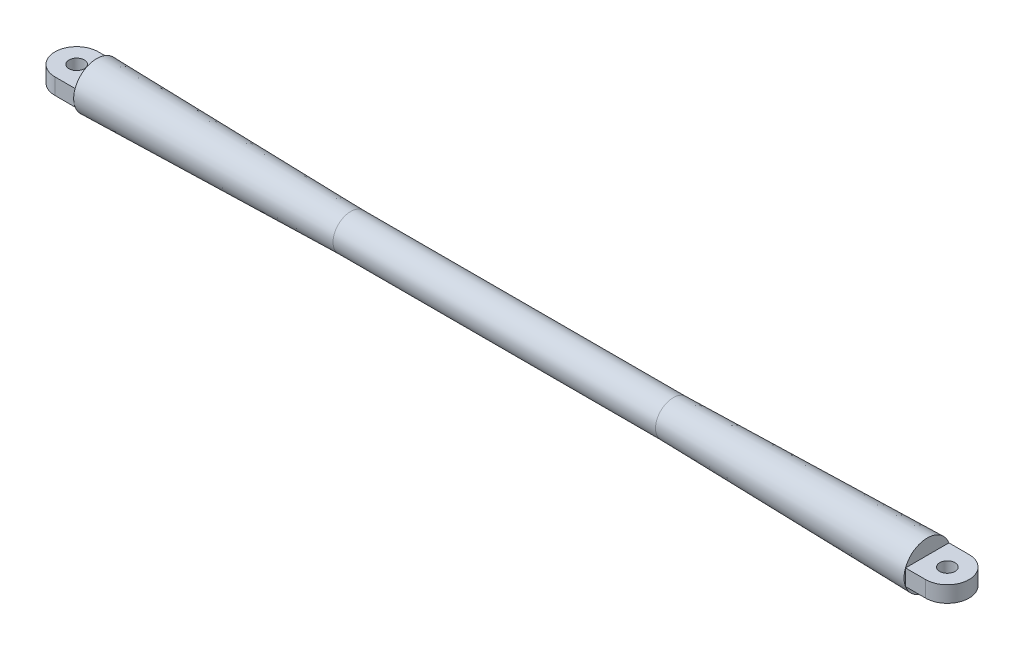
ISO-10303-21;
HEADER;
FILE_DESCRIPTION(('STEP AP214'),'2;1');
FILE_NAME('part.step','',(''),(''),'','','');
FILE_SCHEMA(('AUTOMOTIVE_DESIGN { 1 0 10303 214 1 1 1 1 }'));
ENDSEC;
DATA;
#1=APPLICATION_CONTEXT('core data for automotive mechanical design processes');
#2=APPLICATION_PROTOCOL_DEFINITION('international standard','automotive_design',2000,#1);
#3=PRODUCT_CONTEXT('',#1,'mechanical');
#4=PRODUCT('Part','Part','',(#3));
#5=PRODUCT_RELATED_PRODUCT_CATEGORY('part','',(#4));
#6=PRODUCT_DEFINITION_FORMATION('','',#4);
#7=PRODUCT_DEFINITION_CONTEXT('part definition',#1,'design');
#8=PRODUCT_DEFINITION('design','',#6,#7);
#9=PRODUCT_DEFINITION_SHAPE('','',#8);
#10=(LENGTH_UNIT() NAMED_UNIT(*) SI_UNIT(.MILLI.,.METRE.));
#11=(NAMED_UNIT(*) PLANE_ANGLE_UNIT() SI_UNIT($,.RADIAN.));
#12=(NAMED_UNIT(*) SI_UNIT($,.STERADIAN.) SOLID_ANGLE_UNIT());
#13=UNCERTAINTY_MEASURE_WITH_UNIT(LENGTH_MEASURE(1.E-05),#10,'distance_accuracy_value','');
#14=(GEOMETRIC_REPRESENTATION_CONTEXT(3) GLOBAL_UNCERTAINTY_ASSIGNED_CONTEXT((#13)) GLOBAL_UNIT_ASSIGNED_CONTEXT((#10,
#11,#12)) REPRESENTATION_CONTEXT('',''));
#15=CARTESIAN_POINT('',(0.,0.,0.));
#16=DIRECTION('',(0.,0.,1.));
#17=DIRECTION('',(1.,0.,0.));
#18=AXIS2_PLACEMENT_3D('',#15,#16,#17);
#19=CARTESIAN_POINT('',(575.,0.,0.));
#20=DIRECTION('',(1.,0.,0.));
#21=DIRECTION('',(0.,0.,-1.));
#22=AXIS2_PLACEMENT_3D('',#19,#20,#21);
#23=CONICAL_SURFACE('',#22,30.,0.0213300978711052);
#24=CARTESIAN_POINT('',(200.,0.,0.));
#25=DIRECTION('',(-1.,0.,0.));
#26=DIRECTION('',(0.,0.,1.));
#27=AXIS2_PLACEMENT_3D('',#24,#25,#26);
#28=CIRCLE('',#27,22.);
#29=CARTESIAN_POINT('',(200.,0.,22.));
#30=VERTEX_POINT('',#29);
#31=EDGE_CURVE('E216',#30,#30,#28,.T.);
#32=ORIENTED_EDGE('',*,*,#31,.F.);
#33=EDGE_LOOP('',(#32));
#34=FACE_BOUND('',#33,.T.);
#35=CARTESIAN_POINT('',(515.,0.,0.));
#36=DIRECTION('',(-1.,0.,0.));
#37=DIRECTION('',(0.,0.,1.));
#38=AXIS2_PLACEMENT_3D('',#35,#36,#37);
#39=CIRCLE('',#38,28.72);
#40=CARTESIAN_POINT('',(515.,10.,26.9228230317699));
#41=VERTEX_POINT('',#40);
#42=CARTESIAN_POINT('',(515.,10.,-26.9228230317699));
#43=VERTEX_POINT('',#42);
#44=EDGE_CURVE('E227',#41,#43,#39,.T.);
#45=ORIENTED_EDGE('',*,*,#44,.T.);
#46=CARTESIAN_POINT('',(515.,0.,0.));
#47=DIRECTION('',(-1.,0.,0.));
#48=DIRECTION('',(0.,-1.,0.));
#49=AXIS2_PLACEMENT_3D('',#46,#47,#48);
#50=CIRCLE('',#49,28.72);
#51=CARTESIAN_POINT('',(515.,-10.,-26.9228230317699));
#52=VERTEX_POINT('',#51);
#53=EDGE_CURVE('E207',#43,#52,#50,.T.);
#54=ORIENTED_EDGE('',*,*,#53,.T.);
#55=CARTESIAN_POINT('',(515.,0.,0.));
#56=DIRECTION('',(-1.,0.,0.));
#57=DIRECTION('',(0.,0.,1.));
#58=AXIS2_PLACEMENT_3D('',#55,#56,#57);
#59=CIRCLE('',#58,28.72);
#60=CARTESIAN_POINT('',(515.,-10.,26.9228230317699));
#61=VERTEX_POINT('',#60);
#62=EDGE_CURVE('E223',#52,#61,#59,.T.);
#63=ORIENTED_EDGE('',*,*,#62,.T.);
#64=CARTESIAN_POINT('',(515.,0.,0.));
#65=DIRECTION('',(-1.,0.,0.));
#66=DIRECTION('',(0.,-1.,0.));
#67=AXIS2_PLACEMENT_3D('',#64,#65,#66);
#68=CIRCLE('',#67,28.72);
#69=EDGE_CURVE('E203',#61,#41,#68,.T.);
#70=ORIENTED_EDGE('',*,*,#69,.T.);
#71=EDGE_LOOP('',(#45,#54,#63,#70));
#72=FACE_BOUND('',#71,.T.);
#73=ADVANCED_FACE('F41',(#34,#72),#23,.T.);
#74=CARTESIAN_POINT('',(0.,0.,0.));
#75=DIRECTION('',(-1.,0.,0.));
#76=DIRECTION('',(0.,0.,1.));
#77=AXIS2_PLACEMENT_3D('',#74,#75,#76);
#78=CYLINDRICAL_SURFACE('',#77,22.);
#79=ORIENTED_EDGE('',*,*,#31,.T.);
#80=EDGE_LOOP('',(#79));
#81=FACE_BOUND('',#80,.T.);
#82=CARTESIAN_POINT('',(-200.,0.,0.));
#83=DIRECTION('',(-1.,0.,0.));
#84=DIRECTION('',(0.,0.,1.));
#85=AXIS2_PLACEMENT_3D('',#82,#83,#84);
#86=CIRCLE('',#85,22.);
#87=CARTESIAN_POINT('',(-200.,0.,22.));
#88=VERTEX_POINT('',#87);
#89=EDGE_CURVE('E153',#88,#88,#86,.T.);
#90=ORIENTED_EDGE('',*,*,#89,.F.);
#91=EDGE_LOOP('',(#90));
#92=FACE_BOUND('',#91,.T.);
#93=ADVANCED_FACE('F268',(#81,#92),#78,.T.);
#94=CARTESIAN_POINT('',(515.,-50.2037310224128,-35.));
#95=DIRECTION('',(-1.,0.,0.));
#96=DIRECTION('',(0.,0.,1.));
#97=AXIS2_PLACEMENT_3D('',#94,#95,#96);
#98=PLANE('',#97);
#99=DIRECTION('',(0.,0.,1.));
#100=VECTOR('',#99,1.);
#101=CARTESIAN_POINT('',(515.,-10.,-35.));
#102=LINE('',#101,#100);
#103=EDGE_CURVE('E211',#52,#61,#102,.T.);
#104=ORIENTED_EDGE('',*,*,#103,.T.);
#105=ORIENTED_EDGE('',*,*,#62,.F.);
#106=EDGE_LOOP('',(#104,#105));
#107=FACE_BOUND('',#106,.T.);
#108=ADVANCED_FACE('F249',(#107),#98,.F.);
#109=CARTESIAN_POINT('',(515.,-10.,-35.));
#110=DIRECTION('',(0.,1.,0.));
#111=DIRECTION('',(-1.,0.,0.));
#112=AXIS2_PLACEMENT_3D('',#109,#110,#111);
#113=PLANE('',#112);
#114=CARTESIAN_POINT('',(540.,-10.,0.));
#115=DIRECTION('',(0.,1.,0.));
#116=DIRECTION('',(-1.,0.,0.));
#117=AXIS2_PLACEMENT_3D('',#114,#115,#116);
#118=CIRCLE('',#117,9.49999999999995);
#119=CARTESIAN_POINT('',(530.5,-10.,0.));
#120=VERTEX_POINT('',#119);
#121=EDGE_CURVE('E175',#120,#120,#118,.T.);
#122=ORIENTED_EDGE('',*,*,#121,.T.);
#123=EDGE_LOOP('',(#122));
#124=FACE_BOUND('',#123,.T.);
#125=CARTESIAN_POINT('',(540.,-10.,0.));
#126=DIRECTION('',(0.,1.,0.));
#127=DIRECTION('',(-1.,0.,0.));
#128=AXIS2_PLACEMENT_3D('',#125,#126,#127);
#129=CIRCLE('',#128,26.9228230317699);
#130=CARTESIAN_POINT('',(540.,-10.,-26.9228230317699));
#131=VERTEX_POINT('',#130);
#132=CARTESIAN_POINT('',(540.,-10.,26.9228230317699));
#133=VERTEX_POINT('',#132);
#134=EDGE_CURVE('E195',#131,#133,#129,.F.);
#135=ORIENTED_EDGE('',*,*,#134,.T.);
#136=DIRECTION('',(-1.,0.,0.));
#137=VECTOR('',#136,1.);
#138=CARTESIAN_POINT('',(515.,-10.,26.9228230317699));
#139=LINE('',#138,#137);
#140=EDGE_CURVE('E199',#133,#61,#139,.T.);
#141=ORIENTED_EDGE('',*,*,#140,.T.);
#142=ORIENTED_EDGE('',*,*,#103,.F.);
#143=DIRECTION('',(1.,0.,0.));
#144=VECTOR('',#143,1.);
#145=CARTESIAN_POINT('',(515.,-10.,-26.9228230317699));
#146=LINE('',#145,#144);
#147=EDGE_CURVE('E182',#52,#131,#146,.T.);
#148=ORIENTED_EDGE('',*,*,#147,.T.);
#149=EDGE_LOOP('',(#135,#141,#142,#148));
#150=FACE_BOUND('',#149,.T.);
#151=ADVANCED_FACE('F246',(#124,#150),#113,.F.);
#152=CARTESIAN_POINT('',(515.,50.2037310224128,-35.));
#153=DIRECTION('',(-1.,0.,0.));
#154=DIRECTION('',(0.,0.,1.));
#155=AXIS2_PLACEMENT_3D('',#152,#153,#154);
#156=PLANE('',#155);
#157=DIRECTION('',(0.,0.,1.));
#158=VECTOR('',#157,1.);
#159=CARTESIAN_POINT('',(515.,10.,-35.));
#160=LINE('',#159,#158);
#161=EDGE_CURVE('E212',#43,#41,#160,.T.);
#162=ORIENTED_EDGE('',*,*,#161,.F.);
#163=ORIENTED_EDGE('',*,*,#44,.F.);
#164=EDGE_LOOP('',(#162,#163));
#165=FACE_BOUND('',#164,.T.);
#166=ADVANCED_FACE('F263',(#165),#156,.F.);
#167=CARTESIAN_POINT('',(515.,10.,-35.));
#168=DIRECTION('',(0.,-1.,0.));
#169=DIRECTION('',(1.,0.,0.));
#170=AXIS2_PLACEMENT_3D('',#167,#168,#169);
#171=PLANE('',#170);
#172=CARTESIAN_POINT('',(540.,10.,0.));
#173=DIRECTION('',(0.,1.,0.));
#174=DIRECTION('',(-1.,0.,0.));
#175=AXIS2_PLACEMENT_3D('',#172,#173,#174);
#176=CIRCLE('',#175,9.49999999999995);
#177=CARTESIAN_POINT('',(530.5,10.,0.));
#178=VERTEX_POINT('',#177);
#179=EDGE_CURVE('E171',#178,#178,#176,.T.);
#180=ORIENTED_EDGE('',*,*,#179,.F.);
#181=EDGE_LOOP('',(#180));
#182=FACE_BOUND('',#181,.T.);
#183=ORIENTED_EDGE('',*,*,#161,.T.);
#184=DIRECTION('',(1.,0.,0.));
#185=VECTOR('',#184,1.);
#186=CARTESIAN_POINT('',(515.,10.,26.9228230317699));
#187=LINE('',#186,#185);
#188=CARTESIAN_POINT('',(540.,10.,26.9228230317699));
#189=VERTEX_POINT('',#188);
#190=EDGE_CURVE('E11',#41,#189,#187,.T.);
#191=ORIENTED_EDGE('',*,*,#190,.T.);
#192=CARTESIAN_POINT('',(540.,10.,0.));
#193=DIRECTION('',(0.,-1.,0.));
#194=DIRECTION('',(1.,0.,0.));
#195=AXIS2_PLACEMENT_3D('',#192,#193,#194);
#196=CIRCLE('',#195,26.9228230317699);
#197=CARTESIAN_POINT('',(540.,10.,-26.9228230317699));
#198=VERTEX_POINT('',#197);
#199=EDGE_CURVE('E49',#189,#198,#196,.F.);
#200=ORIENTED_EDGE('',*,*,#199,.T.);
#201=DIRECTION('',(-1.,0.,0.));
#202=VECTOR('',#201,1.);
#203=CARTESIAN_POINT('',(515.,10.,-26.9228230317699));
#204=LINE('',#203,#202);
#205=EDGE_CURVE('E231',#198,#43,#204,.T.);
#206=ORIENTED_EDGE('',*,*,#205,.T.);
#207=EDGE_LOOP('',(#183,#191,#200,#206));
#208=FACE_BOUND('',#207,.T.);
#209=ADVANCED_FACE('F237',(#182,#208),#171,.F.);
#210=CARTESIAN_POINT('',(515.,-25.,-26.9228230317699));
#211=DIRECTION('',(-1.,0.,0.));
#212=DIRECTION('',(0.,-1.,0.));
#213=AXIS2_PLACEMENT_3D('',#210,#211,#212);
#214=PLANE('',#213);
#215=DIRECTION('',(0.,1.,0.));
#216=VECTOR('',#215,1.);
#217=CARTESIAN_POINT('',(515.,-25.,-26.9228230317699));
#218=LINE('',#217,#216);
#219=EDGE_CURVE('E56',#52,#43,#218,.T.);
#220=ORIENTED_EDGE('',*,*,#219,.F.);
#221=ORIENTED_EDGE('',*,*,#53,.F.);
#222=EDGE_LOOP('',(#220,#221));
#223=FACE_BOUND('',#222,.T.);
#224=ADVANCED_FACE('F253',(#223),#214,.F.);
#225=CARTESIAN_POINT('',(515.,-25.,33.4261094628097));
#226=DIRECTION('',(-1.,0.,0.));
#227=DIRECTION('',(0.,-1.,0.));
#228=AXIS2_PLACEMENT_3D('',#225,#226,#227);
#229=PLANE('',#228);
#230=DIRECTION('',(0.,1.,0.));
#231=VECTOR('',#230,1.);
#232=CARTESIAN_POINT('',(515.,-25.,26.9228230317699));
#233=LINE('',#232,#231);
#234=EDGE_CURVE('E179',#61,#41,#233,.T.);
#235=ORIENTED_EDGE('',*,*,#234,.T.);
#236=ORIENTED_EDGE('',*,*,#69,.F.);
#237=EDGE_LOOP('',(#235,#236));
#238=FACE_BOUND('',#237,.T.);
#239=ADVANCED_FACE('F255',(#238),#229,.F.);
#240=CARTESIAN_POINT('',(540.,-25.,26.9228230317699));
#241=DIRECTION('',(0.,0.,-1.));
#242=DIRECTION('',(-1.,0.,0.));
#243=AXIS2_PLACEMENT_3D('',#240,#241,#242);
#244=PLANE('',#243);
#245=DIRECTION('',(0.,1.,0.));
#246=VECTOR('',#245,1.);
#247=CARTESIAN_POINT('',(540.,-25.,26.9228230317699));
#248=LINE('',#247,#246);
#249=EDGE_CURVE('E183',#133,#189,#248,.T.);
#250=ORIENTED_EDGE('',*,*,#249,.T.);
#251=ORIENTED_EDGE('',*,*,#190,.F.);
#252=ORIENTED_EDGE('',*,*,#234,.F.);
#253=ORIENTED_EDGE('',*,*,#140,.F.);
#254=EDGE_LOOP('',(#250,#251,#252,#253));
#255=FACE_BOUND('',#254,.T.);
#256=ADVANCED_FACE('F243',(#255),#244,.F.);
#257=CARTESIAN_POINT('',(540.,-25.,0.));
#258=DIRECTION('',(0.,1.,0.));
#259=DIRECTION('',(-1.,0.,0.));
#260=AXIS2_PLACEMENT_3D('',#257,#258,#259);
#261=CYLINDRICAL_SURFACE('',#260,26.9228230317699);
#262=DIRECTION('',(0.,1.,0.));
#263=VECTOR('',#262,1.);
#264=CARTESIAN_POINT('',(540.,-25.,-26.9228230317699));
#265=LINE('',#264,#263);
#266=EDGE_CURVE('E186',#131,#198,#265,.T.);
#267=ORIENTED_EDGE('',*,*,#266,.T.);
#268=ORIENTED_EDGE('',*,*,#199,.F.);
#269=ORIENTED_EDGE('',*,*,#249,.F.);
#270=ORIENTED_EDGE('',*,*,#134,.F.);
#271=EDGE_LOOP('',(#267,#268,#269,#270));
#272=FACE_BOUND('',#271,.T.);
#273=ADVANCED_FACE('F241',(#272),#261,.T.);
#274=CARTESIAN_POINT('',(515.,-25.,-26.9228230317699));
#275=DIRECTION('',(0.,0.,1.));
#276=DIRECTION('',(1.,0.,0.));
#277=AXIS2_PLACEMENT_3D('',#274,#275,#276);
#278=PLANE('',#277);
#279=ORIENTED_EDGE('',*,*,#219,.T.);
#280=ORIENTED_EDGE('',*,*,#205,.F.);
#281=ORIENTED_EDGE('',*,*,#266,.F.);
#282=ORIENTED_EDGE('',*,*,#147,.F.);
#283=EDGE_LOOP('',(#279,#280,#281,#282));
#284=FACE_BOUND('',#283,.T.);
#285=ADVANCED_FACE('F286',(#284),#278,.F.);
#286=CARTESIAN_POINT('',(540.,-28.72,0.));
#287=DIRECTION('',(0.,1.,0.));
#288=DIRECTION('',(-1.,0.,0.));
#289=AXIS2_PLACEMENT_3D('',#286,#287,#288);
#290=CYLINDRICAL_SURFACE('',#289,9.49999999999995);
#291=ORIENTED_EDGE('',*,*,#179,.T.);
#292=EDGE_LOOP('',(#291));
#293=FACE_BOUND('',#292,.T.);
#294=ORIENTED_EDGE('',*,*,#121,.F.);
#295=EDGE_LOOP('',(#294));
#296=FACE_BOUND('',#295,.T.);
#297=ADVANCED_FACE('F279',(#293,#296),#290,.F.);
#298=CARTESIAN_POINT('',(-575.,0.,0.));
#299=DIRECTION('',(-1.,0.,0.));
#300=DIRECTION('',(0.,0.,-1.));
#301=AXIS2_PLACEMENT_3D('',#298,#299,#300);
#302=CONICAL_SURFACE('',#301,30.,0.0213300978711052);
#303=ORIENTED_EDGE('',*,*,#89,.T.);
#304=EDGE_LOOP('',(#303));
#305=FACE_BOUND('',#304,.T.);
#306=CARTESIAN_POINT('',(-515.,0.,0.));
#307=DIRECTION('',(-1.,0.,0.));
#308=DIRECTION('',(0.,0.,1.));
#309=AXIS2_PLACEMENT_3D('',#306,#307,#308);
#310=CIRCLE('',#309,28.72);
#311=CARTESIAN_POINT('',(-515.,10.,26.9228230317699));
#312=VERTEX_POINT('',#311);
#313=CARTESIAN_POINT('',(-515.,10.,-26.9228230317699));
#314=VERTEX_POINT('',#313);
#315=EDGE_CURVE('E152',#312,#314,#310,.T.);
#316=ORIENTED_EDGE('',*,*,#315,.F.);
#317=CARTESIAN_POINT('',(-515.,0.,0.));
#318=DIRECTION('',(-1.,0.,0.));
#319=DIRECTION('',(0.,-1.,0.));
#320=AXIS2_PLACEMENT_3D('',#317,#318,#319);
#321=CIRCLE('',#320,28.72);
#322=CARTESIAN_POINT('',(-515.,-10.,26.9228230317699));
#323=VERTEX_POINT('',#322);
#324=EDGE_CURVE('E147',#323,#312,#321,.T.);
#325=ORIENTED_EDGE('',*,*,#324,.F.);
#326=CARTESIAN_POINT('',(-515.,0.,0.));
#327=DIRECTION('',(-1.,0.,0.));
#328=DIRECTION('',(0.,0.,1.));
#329=AXIS2_PLACEMENT_3D('',#326,#327,#328);
#330=CIRCLE('',#329,28.72);
#331=CARTESIAN_POINT('',(-515.,-10.,-26.9228230317699));
#332=VERTEX_POINT('',#331);
#333=EDGE_CURVE('E135',#332,#323,#330,.T.);
#334=ORIENTED_EDGE('',*,*,#333,.F.);
#335=CARTESIAN_POINT('',(-515.,0.,0.));
#336=DIRECTION('',(-1.,0.,0.));
#337=DIRECTION('',(0.,-1.,0.));
#338=AXIS2_PLACEMENT_3D('',#335,#336,#337);
#339=CIRCLE('',#338,28.72);
#340=EDGE_CURVE('E139',#314,#332,#339,.T.);
#341=ORIENTED_EDGE('',*,*,#340,.F.);
#342=EDGE_LOOP('',(#316,#325,#334,#341));
#343=FACE_BOUND('',#342,.T.);
#344=ADVANCED_FACE('F149',(#305,#343),#302,.T.);
#345=CARTESIAN_POINT('',(-515.,-50.2037310224128,-35.));
#346=DIRECTION('',(1.,0.,0.));
#347=DIRECTION('',(0.,0.,1.));
#348=AXIS2_PLACEMENT_3D('',#345,#346,#347);
#349=PLANE('',#348);
#350=DIRECTION('',(0.,0.,1.));
#351=VECTOR('',#350,1.);
#352=CARTESIAN_POINT('',(-515.,-10.,-35.));
#353=LINE('',#352,#351);
#354=EDGE_CURVE('E125',#332,#323,#353,.T.);
#355=ORIENTED_EDGE('',*,*,#354,.F.);
#356=ORIENTED_EDGE('',*,*,#333,.T.);
#357=EDGE_LOOP('',(#355,#356));
#358=FACE_BOUND('',#357,.T.);
#359=ADVANCED_FACE('F133',(#358),#349,.F.);
#360=CARTESIAN_POINT('',(-515.,-10.,-35.));
#361=DIRECTION('',(0.,1.,0.));
#362=DIRECTION('',(1.,0.,0.));
#363=AXIS2_PLACEMENT_3D('',#360,#361,#362);
#364=PLANE('',#363);
#365=CARTESIAN_POINT('',(-540.,-10.,0.));
#366=DIRECTION('',(0.,-1.,0.));
#367=DIRECTION('',(1.,0.,0.));
#368=AXIS2_PLACEMENT_3D('',#365,#366,#367);
#369=CIRCLE('',#368,9.49999999999995);
#370=CARTESIAN_POINT('',(-530.5,-10.,0.));
#371=VERTEX_POINT('',#370);
#372=EDGE_CURVE('E118',#371,#371,#369,.T.);
#373=ORIENTED_EDGE('',*,*,#372,.F.);
#374=EDGE_LOOP('',(#373));
#375=FACE_BOUND('',#374,.T.);
#376=CARTESIAN_POINT('',(-540.,-10.,0.));
#377=DIRECTION('',(0.,-1.,0.));
#378=DIRECTION('',(1.,0.,0.));
#379=AXIS2_PLACEMENT_3D('',#376,#377,#378);
#380=CIRCLE('',#379,26.9228230317699);
#381=CARTESIAN_POINT('',(-540.,-10.,-26.9228230317699));
#382=VERTEX_POINT('',#381);
#383=CARTESIAN_POINT('',(-540.,-10.,26.9228230317699));
#384=VERTEX_POINT('',#383);
#385=EDGE_CURVE('E128',#382,#384,#380,.F.);
#386=ORIENTED_EDGE('',*,*,#385,.F.);
#387=DIRECTION('',(-1.,0.,0.));
#388=VECTOR('',#387,1.);
#389=CARTESIAN_POINT('',(-515.,-10.,-26.9228230317699));
#390=LINE('',#389,#388);
#391=EDGE_CURVE('E109',#332,#382,#390,.T.);
#392=ORIENTED_EDGE('',*,*,#391,.F.);
#393=ORIENTED_EDGE('',*,*,#354,.T.);
#394=DIRECTION('',(1.,0.,0.));
#395=VECTOR('',#394,1.);
#396=CARTESIAN_POINT('',(-515.,-10.,26.9228230317699));
#397=LINE('',#396,#395);
#398=EDGE_CURVE('E434',#384,#323,#397,.T.);
#399=ORIENTED_EDGE('',*,*,#398,.F.);
#400=EDGE_LOOP('',(#386,#392,#393,#399));
#401=FACE_BOUND('',#400,.T.);
#402=ADVANCED_FACE('F123',(#375,#401),#364,.F.);
#403=CARTESIAN_POINT('',(-515.,50.2037310224128,-35.));
#404=DIRECTION('',(1.,0.,0.));
#405=DIRECTION('',(0.,0.,1.));
#406=AXIS2_PLACEMENT_3D('',#403,#404,#405);
#407=PLANE('',#406);
#408=DIRECTION('',(0.,0.,1.));
#409=VECTOR('',#408,1.);
#410=CARTESIAN_POINT('',(-515.,10.,-35.));
#411=LINE('',#410,#409);
#412=EDGE_CURVE('E138',#314,#312,#411,.T.);
#413=ORIENTED_EDGE('',*,*,#412,.T.);
#414=ORIENTED_EDGE('',*,*,#315,.T.);
#415=EDGE_LOOP('',(#413,#414));
#416=FACE_BOUND('',#415,.T.);
#417=ADVANCED_FACE('F335',(#416),#407,.F.);
#418=CARTESIAN_POINT('',(-515.,10.,-35.));
#419=DIRECTION('',(0.,-1.,0.));
#420=DIRECTION('',(-1.,0.,0.));
#421=AXIS2_PLACEMENT_3D('',#418,#419,#420);
#422=PLANE('',#421);
#423=CARTESIAN_POINT('',(-540.,10.,0.));
#424=DIRECTION('',(0.,-1.,0.));
#425=DIRECTION('',(1.,0.,0.));
#426=AXIS2_PLACEMENT_3D('',#423,#424,#425);
#427=CIRCLE('',#426,9.49999999999995);
#428=CARTESIAN_POINT('',(-530.5,10.,0.));
#429=VERTEX_POINT('',#428);
#430=EDGE_CURVE('E417',#429,#429,#427,.T.);
#431=ORIENTED_EDGE('',*,*,#430,.T.);
#432=EDGE_LOOP('',(#431));
#433=FACE_BOUND('',#432,.T.);
#434=ORIENTED_EDGE('',*,*,#412,.F.);
#435=DIRECTION('',(1.,0.,0.));
#436=VECTOR('',#435,1.);
#437=CARTESIAN_POINT('',(-515.,10.,-26.9228230317699));
#438=LINE('',#437,#436);
#439=CARTESIAN_POINT('',(-540.,10.,-26.9228230317699));
#440=VERTEX_POINT('',#439);
#441=EDGE_CURVE('E112',#440,#314,#438,.T.);
#442=ORIENTED_EDGE('',*,*,#441,.F.);
#443=CARTESIAN_POINT('',(-540.,10.,0.));
#444=DIRECTION('',(0.,1.,0.));
#445=DIRECTION('',(-1.,0.,0.));
#446=AXIS2_PLACEMENT_3D('',#443,#444,#445);
#447=CIRCLE('',#446,26.9228230317699);
#448=CARTESIAN_POINT('',(-540.,10.,26.9228230317699));
#449=VERTEX_POINT('',#448);
#450=EDGE_CURVE('E163',#449,#440,#447,.F.);
#451=ORIENTED_EDGE('',*,*,#450,.F.);
#452=DIRECTION('',(-1.,0.,0.));
#453=VECTOR('',#452,1.);
#454=CARTESIAN_POINT('',(-515.,10.,26.9228230317699));
#455=LINE('',#454,#453);
#456=EDGE_CURVE('E167',#312,#449,#455,.T.);
#457=ORIENTED_EDGE('',*,*,#456,.F.);
#458=EDGE_LOOP('',(#434,#442,#451,#457));
#459=FACE_BOUND('',#458,.T.);
#460=ADVANCED_FACE('F344',(#433,#459),#422,.F.);
#461=CARTESIAN_POINT('',(-515.,-25.,-26.9228230317699));
#462=DIRECTION('',(1.,0.,0.));
#463=DIRECTION('',(0.,-1.,0.));
#464=AXIS2_PLACEMENT_3D('',#461,#462,#463);
#465=PLANE('',#464);
#466=DIRECTION('',(0.,1.,0.));
#467=VECTOR('',#466,1.);
#468=CARTESIAN_POINT('',(-515.,-25.,-26.9228230317699));
#469=LINE('',#468,#467);
#470=EDGE_CURVE('E106',#332,#314,#469,.T.);
#471=ORIENTED_EDGE('',*,*,#470,.T.);
#472=ORIENTED_EDGE('',*,*,#340,.T.);
#473=EDGE_LOOP('',(#471,#472));
#474=FACE_BOUND('',#473,.T.);
#475=ADVANCED_FACE('F142',(#474),#465,.F.);
#476=CARTESIAN_POINT('',(-515.,-25.,33.4261094628097));
#477=DIRECTION('',(1.,0.,0.));
#478=DIRECTION('',(0.,-1.,0.));
#479=AXIS2_PLACEMENT_3D('',#476,#477,#478);
#480=PLANE('',#479);
#481=DIRECTION('',(0.,1.,0.));
#482=VECTOR('',#481,1.);
#483=CARTESIAN_POINT('',(-515.,-25.,26.9228230317699));
#484=LINE('',#483,#482);
#485=EDGE_CURVE('E130',#323,#312,#484,.T.);
#486=ORIENTED_EDGE('',*,*,#485,.F.);
#487=ORIENTED_EDGE('',*,*,#324,.T.);
#488=EDGE_LOOP('',(#486,#487));
#489=FACE_BOUND('',#488,.T.);
#490=ADVANCED_FACE('F363',(#489),#480,.F.);
#491=CARTESIAN_POINT('',(-540.,-25.,26.9228230317699));
#492=DIRECTION('',(0.,0.,-1.));
#493=DIRECTION('',(1.,0.,0.));
#494=AXIS2_PLACEMENT_3D('',#491,#492,#493);
#495=PLANE('',#494);
#496=DIRECTION('',(0.,1.,0.));
#497=VECTOR('',#496,1.);
#498=CARTESIAN_POINT('',(-540.,-25.,26.9228230317699));
#499=LINE('',#498,#497);
#500=EDGE_CURVE('E427',#384,#449,#499,.T.);
#501=ORIENTED_EDGE('',*,*,#500,.F.);
#502=ORIENTED_EDGE('',*,*,#398,.T.);
#503=ORIENTED_EDGE('',*,*,#485,.T.);
#504=ORIENTED_EDGE('',*,*,#456,.T.);
#505=EDGE_LOOP('',(#501,#502,#503,#504));
#506=FACE_BOUND('',#505,.T.);
#507=ADVANCED_FACE('F372',(#506),#495,.F.);
#508=CARTESIAN_POINT('',(-540.,-25.,0.));
#509=DIRECTION('',(0.,1.,0.));
#510=DIRECTION('',(1.,0.,0.));
#511=AXIS2_PLACEMENT_3D('',#508,#509,#510);
#512=CYLINDRICAL_SURFACE('',#511,26.9228230317699);
#513=DIRECTION('',(0.,1.,0.));
#514=VECTOR('',#513,1.);
#515=CARTESIAN_POINT('',(-540.,-25.,-26.9228230317699));
#516=LINE('',#515,#514);
#517=EDGE_CURVE('E117',#382,#440,#516,.T.);
#518=ORIENTED_EDGE('',*,*,#517,.F.);
#519=ORIENTED_EDGE('',*,*,#385,.T.);
#520=ORIENTED_EDGE('',*,*,#500,.T.);
#521=ORIENTED_EDGE('',*,*,#450,.T.);
#522=EDGE_LOOP('',(#518,#519,#520,#521));
#523=FACE_BOUND('',#522,.T.);
#524=ADVANCED_FACE('F382',(#523),#512,.T.);
#525=CARTESIAN_POINT('',(-515.,-25.,-26.9228230317699));
#526=DIRECTION('',(0.,0.,1.));
#527=DIRECTION('',(-1.,0.,0.));
#528=AXIS2_PLACEMENT_3D('',#525,#526,#527);
#529=PLANE('',#528);
#530=ORIENTED_EDGE('',*,*,#470,.F.);
#531=ORIENTED_EDGE('',*,*,#391,.T.);
#532=ORIENTED_EDGE('',*,*,#517,.T.);
#533=ORIENTED_EDGE('',*,*,#441,.T.);
#534=EDGE_LOOP('',(#530,#531,#532,#533));
#535=FACE_BOUND('',#534,.T.);
#536=ADVANCED_FACE('F108',(#535),#529,.F.);
#537=CARTESIAN_POINT('',(-540.,-28.72,0.));
#538=DIRECTION('',(0.,1.,0.));
#539=DIRECTION('',(1.,0.,0.));
#540=AXIS2_PLACEMENT_3D('',#537,#538,#539);
#541=CYLINDRICAL_SURFACE('',#540,9.49999999999995);
#542=ORIENTED_EDGE('',*,*,#430,.F.);
#543=EDGE_LOOP('',(#542));
#544=FACE_BOUND('',#543,.T.);
#545=ORIENTED_EDGE('',*,*,#372,.T.);
#546=EDGE_LOOP('',(#545));
#547=FACE_BOUND('',#546,.T.);
#548=ADVANCED_FACE('F401',(#544,#547),#541,.F.);
#549=CLOSED_SHELL('',(#73,#93,#108,#151,#166,#209,#224,#239,#256,#273,#285,#297,#344,#359,#402,
#417,#460,#475,#490,#507,#524,#536,#548));
#550=MANIFOLD_SOLID_BREP('B2',#549);
#551=ADVANCED_BREP_SHAPE_REPRESENTATION('',(#18,#550),#14);
#552=SHAPE_DEFINITION_REPRESENTATION(#9,#551);
ENDSEC;
END-ISO-10303-21;
